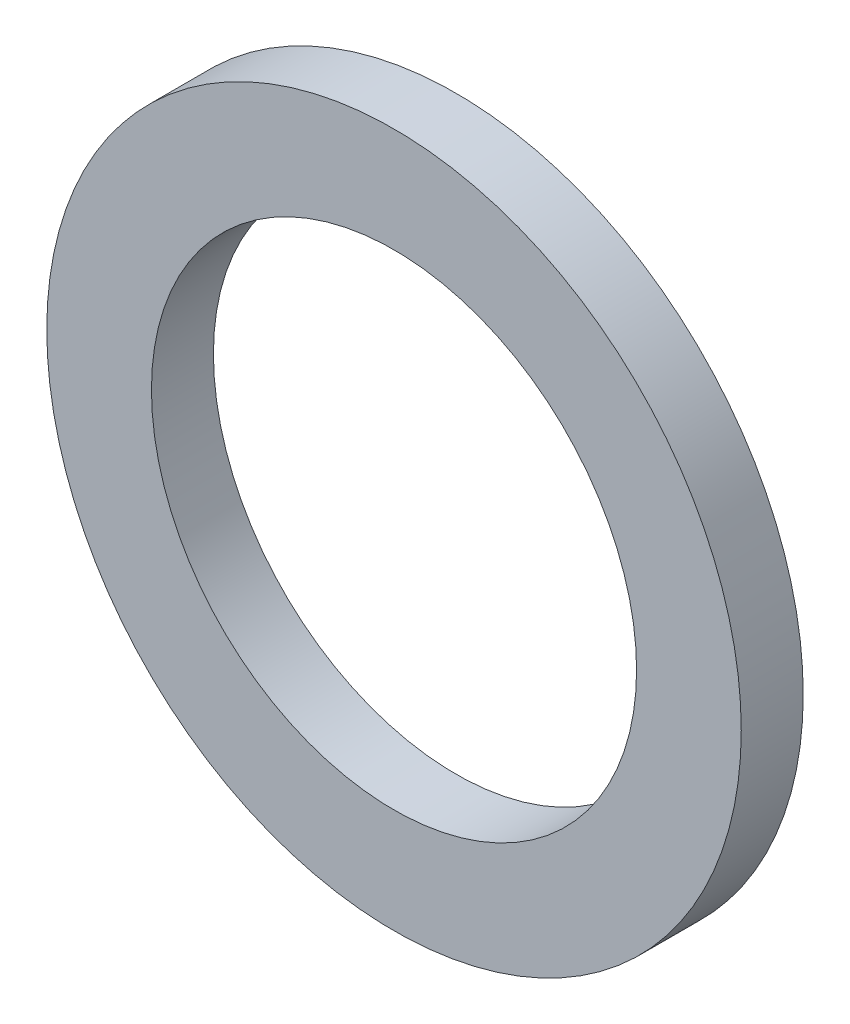
ISO-10303-21;
HEADER;
FILE_DESCRIPTION(('STEP AP214'),'2;1');
FILE_NAME('part.step','',(''),(''),'','','');
FILE_SCHEMA(('AUTOMOTIVE_DESIGN { 1 0 10303 214 1 1 1 1 }'));
ENDSEC;
DATA;
#1=APPLICATION_CONTEXT('core data for automotive mechanical design processes');
#2=APPLICATION_PROTOCOL_DEFINITION('international standard','automotive_design',2000,#1);
#3=PRODUCT_CONTEXT('',#1,'mechanical');
#4=PRODUCT('Part','Part','',(#3));
#5=PRODUCT_RELATED_PRODUCT_CATEGORY('part','',(#4));
#6=PRODUCT_DEFINITION_FORMATION('','',#4);
#7=PRODUCT_DEFINITION_CONTEXT('part definition',#1,'design');
#8=PRODUCT_DEFINITION('design','',#6,#7);
#9=PRODUCT_DEFINITION_SHAPE('','',#8);
#10=(LENGTH_UNIT() NAMED_UNIT(*) SI_UNIT(.MILLI.,.METRE.));
#11=(NAMED_UNIT(*) PLANE_ANGLE_UNIT() SI_UNIT($,.RADIAN.));
#12=(NAMED_UNIT(*) SI_UNIT($,.STERADIAN.) SOLID_ANGLE_UNIT());
#13=UNCERTAINTY_MEASURE_WITH_UNIT(LENGTH_MEASURE(1.E-05),#10,'distance_accuracy_value','');
#14=(GEOMETRIC_REPRESENTATION_CONTEXT(3) GLOBAL_UNCERTAINTY_ASSIGNED_CONTEXT((#13)) GLOBAL_UNIT_ASSIGNED_CONTEXT((#10,
#11,#12)) REPRESENTATION_CONTEXT('',''));
#15=CARTESIAN_POINT('',(0.,0.,0.));
#16=DIRECTION('',(0.,0.,1.));
#17=DIRECTION('',(1.,0.,0.));
#18=AXIS2_PLACEMENT_3D('',#15,#16,#17);
#19=CARTESIAN_POINT('',(0.,0.,4.7371));
#20=DIRECTION('',(0.,0.,1.));
#21=DIRECTION('',(1.,0.,0.));
#22=AXIS2_PLACEMENT_3D('',#19,#20,#21);
#23=PLANE('',#22);
#24=CARTESIAN_POINT('',(0.,0.,4.7371));
#25=DIRECTION('',(0.,0.,1.));
#26=DIRECTION('',(1.,0.,0.));
#27=AXIS2_PLACEMENT_3D('',#24,#25,#26);
#28=CIRCLE('',#27,26.543);
#29=CARTESIAN_POINT('',(26.543,0.,4.7371));
#30=VERTEX_POINT('',#29);
#31=EDGE_CURVE('E11',#30,#30,#28,.T.);
#32=ORIENTED_EDGE('',*,*,#31,.T.);
#33=EDGE_LOOP('',(#32));
#34=FACE_BOUND('',#33,.T.);
#35=CARTESIAN_POINT('',(0.,0.,4.7371));
#36=DIRECTION('',(0.,0.,1.));
#37=DIRECTION('',(1.,0.,0.));
#38=AXIS2_PLACEMENT_3D('',#35,#36,#37);
#39=CIRCLE('',#38,18.542);
#40=CARTESIAN_POINT('',(18.542,0.,4.7371));
#41=VERTEX_POINT('',#40);
#42=EDGE_CURVE('E60',#41,#41,#39,.T.);
#43=ORIENTED_EDGE('',*,*,#42,.F.);
#44=EDGE_LOOP('',(#43));
#45=FACE_BOUND('',#44,.T.);
#46=ADVANCED_FACE('F47',(#34,#45),#23,.T.);
#47=CARTESIAN_POINT('',(0.,0.,0.));
#48=DIRECTION('',(0.,0.,1.));
#49=DIRECTION('',(1.,0.,0.));
#50=AXIS2_PLACEMENT_3D('',#47,#48,#49);
#51=PLANE('',#50);
#52=CARTESIAN_POINT('',(0.,0.,0.));
#53=DIRECTION('',(0.,0.,1.));
#54=DIRECTION('',(1.,0.,0.));
#55=AXIS2_PLACEMENT_3D('',#52,#53,#54);
#56=CIRCLE('',#55,26.543);
#57=CARTESIAN_POINT('',(26.543,0.,0.));
#58=VERTEX_POINT('',#57);
#59=EDGE_CURVE('E51',#58,#58,#56,.T.);
#60=ORIENTED_EDGE('',*,*,#59,.F.);
#61=EDGE_LOOP('',(#60));
#62=FACE_BOUND('',#61,.T.);
#63=CARTESIAN_POINT('',(0.,0.,0.));
#64=DIRECTION('',(0.,0.,1.));
#65=DIRECTION('',(1.,0.,0.));
#66=AXIS2_PLACEMENT_3D('',#63,#64,#65);
#67=CIRCLE('',#66,18.542);
#68=CARTESIAN_POINT('',(18.542,0.,0.));
#69=VERTEX_POINT('',#68);
#70=EDGE_CURVE('E62',#69,#69,#67,.T.);
#71=ORIENTED_EDGE('',*,*,#70,.T.);
#72=EDGE_LOOP('',(#71));
#73=FACE_BOUND('',#72,.T.);
#74=ADVANCED_FACE('F74',(#62,#73),#51,.F.);
#75=CARTESIAN_POINT('',(0.,0.,4.7371));
#76=DIRECTION('',(0.,0.,-1.));
#77=DIRECTION('',(-1.,0.,0.));
#78=AXIS2_PLACEMENT_3D('',#75,#76,#77);
#79=CYLINDRICAL_SURFACE('',#78,26.543);
#80=ORIENTED_EDGE('',*,*,#31,.F.);
#81=EDGE_LOOP('',(#80));
#82=FACE_BOUND('',#81,.T.);
#83=ORIENTED_EDGE('',*,*,#59,.T.);
#84=EDGE_LOOP('',(#83));
#85=FACE_BOUND('',#84,.T.);
#86=ADVANCED_FACE('F49',(#82,#85),#79,.T.);
#87=CARTESIAN_POINT('',(0.,0.,4.7371));
#88=DIRECTION('',(0.,0.,-1.));
#89=DIRECTION('',(-1.,0.,0.));
#90=AXIS2_PLACEMENT_3D('',#87,#88,#89);
#91=CYLINDRICAL_SURFACE('',#90,18.542);
#92=ORIENTED_EDGE('',*,*,#42,.T.);
#93=EDGE_LOOP('',(#92));
#94=FACE_BOUND('',#93,.T.);
#95=ORIENTED_EDGE('',*,*,#70,.F.);
#96=EDGE_LOOP('',(#95));
#97=FACE_BOUND('',#96,.T.);
#98=ADVANCED_FACE('F70',(#94,#97),#91,.F.);
#99=CLOSED_SHELL('',(#46,#74,#86,#98));
#100=MANIFOLD_SOLID_BREP('B2',#99);
#101=ADVANCED_BREP_SHAPE_REPRESENTATION('',(#18,#100),#14);
#102=SHAPE_DEFINITION_REPRESENTATION(#9,#101);
ENDSEC;
END-ISO-10303-21;
